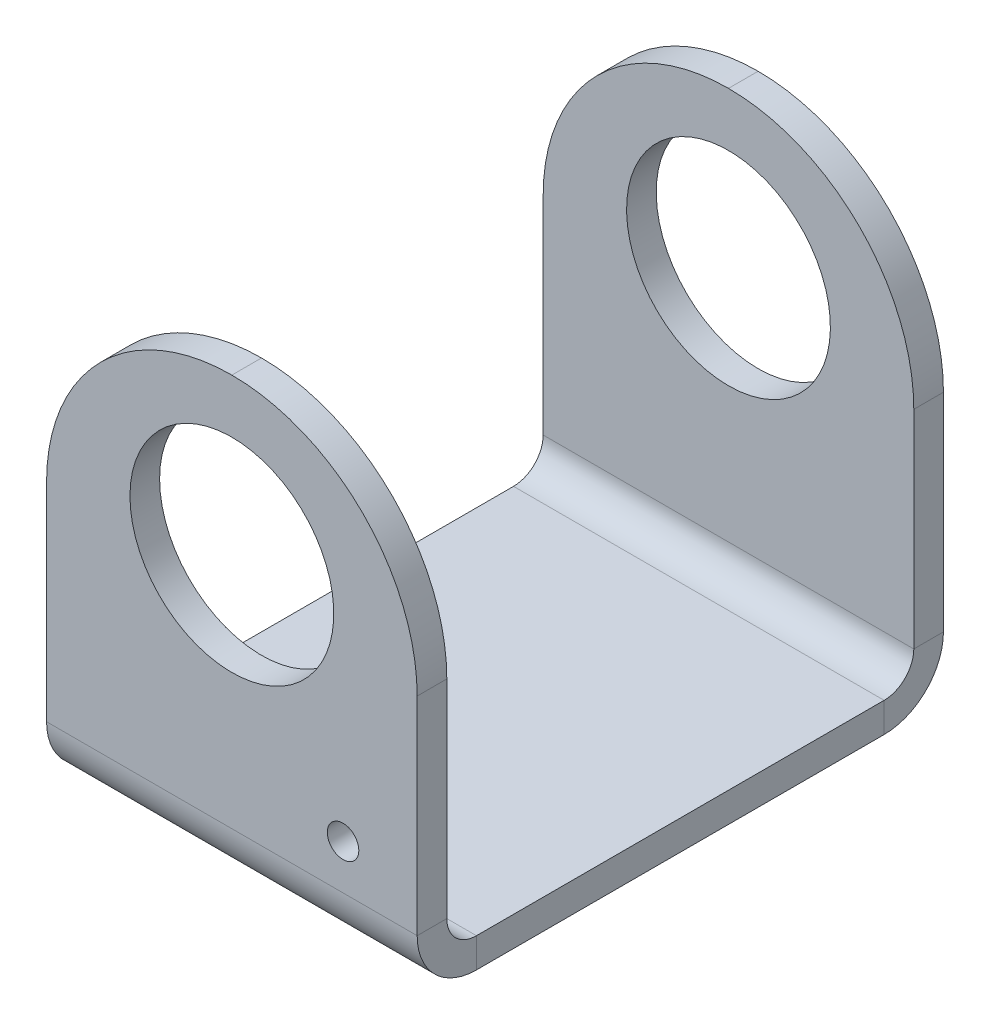
ISO-10303-21;
HEADER;
FILE_DESCRIPTION(('STEP AP214'),'2;1');
FILE_NAME('part.step','',(''),(''),'','','');
FILE_SCHEMA(('AUTOMOTIVE_DESIGN { 1 0 10303 214 1 1 1 1 }'));
ENDSEC;
DATA;
#1=APPLICATION_CONTEXT('core data for automotive mechanical design processes');
#2=APPLICATION_PROTOCOL_DEFINITION('international standard','automotive_design',2000,#1);
#3=PRODUCT_CONTEXT('',#1,'mechanical');
#4=PRODUCT('Part','Part','',(#3));
#5=PRODUCT_RELATED_PRODUCT_CATEGORY('part','',(#4));
#6=PRODUCT_DEFINITION_FORMATION('','',#4);
#7=PRODUCT_DEFINITION_CONTEXT('part definition',#1,'design');
#8=PRODUCT_DEFINITION('design','',#6,#7);
#9=PRODUCT_DEFINITION_SHAPE('','',#8);
#10=(LENGTH_UNIT() NAMED_UNIT(*) SI_UNIT(.MILLI.,.METRE.));
#11=(NAMED_UNIT(*) PLANE_ANGLE_UNIT() SI_UNIT($,.RADIAN.));
#12=(NAMED_UNIT(*) SI_UNIT($,.STERADIAN.) SOLID_ANGLE_UNIT());
#13=UNCERTAINTY_MEASURE_WITH_UNIT(LENGTH_MEASURE(1.E-05),#10,'distance_accuracy_value','');
#14=(GEOMETRIC_REPRESENTATION_CONTEXT(3) GLOBAL_UNCERTAINTY_ASSIGNED_CONTEXT((#13)) GLOBAL_UNIT_ASSIGNED_CONTEXT((#10,
#11,#12)) REPRESENTATION_CONTEXT('',''));
#15=CARTESIAN_POINT('',(0.,0.,0.));
#16=DIRECTION('',(0.,0.,1.));
#17=DIRECTION('',(1.,0.,0.));
#18=AXIS2_PLACEMENT_3D('',#15,#16,#17);
#19=CARTESIAN_POINT('',(-50.,-8.,-55.));
#20=DIRECTION('',(-1.,0.,0.));
#21=DIRECTION('',(0.,0.,1.));
#22=AXIS2_PLACEMENT_3D('',#19,#20,#21);
#23=PLANE('',#22);
#24=DIRECTION('',(0.,0.,1.));
#25=VECTOR('',#24,1.);
#26=CARTESIAN_POINT('',(-50.,0.,-55.));
#27=LINE('',#26,#25);
#28=CARTESIAN_POINT('',(-50.,0.,-55.));
#29=VERTEX_POINT('',#28);
#30=CARTESIAN_POINT('',(-50.,0.,55.));
#31=VERTEX_POINT('',#30);
#32=EDGE_CURVE('E269',#29,#31,#27,.T.);
#33=ORIENTED_EDGE('',*,*,#32,.F.);
#34=DIRECTION('',(0.,1.,0.));
#35=VECTOR('',#34,1.);
#36=CARTESIAN_POINT('',(-50.,-8.,-55.));
#37=LINE('',#36,#35);
#38=CARTESIAN_POINT('',(-50.,-8.0000000000001,-55.));
#39=VERTEX_POINT('',#38);
#40=EDGE_CURVE('E299',#39,#29,#37,.T.);
#41=ORIENTED_EDGE('',*,*,#40,.F.);
#42=DIRECTION('',(0.,0.,1.));
#43=VECTOR('',#42,1.);
#44=CARTESIAN_POINT('',(-50.,-8.,-55.));
#45=LINE('',#44,#43);
#46=CARTESIAN_POINT('',(-50.,-8.,55.));
#47=VERTEX_POINT('',#46);
#48=EDGE_CURVE('E278',#39,#47,#45,.T.);
#49=ORIENTED_EDGE('',*,*,#48,.T.);
#50=DIRECTION('',(0.,1.,0.));
#51=VECTOR('',#50,1.);
#52=CARTESIAN_POINT('',(-50.,-8.,55.));
#53=LINE('',#52,#51);
#54=EDGE_CURVE('E288',#47,#31,#53,.T.);
#55=ORIENTED_EDGE('',*,*,#54,.T.);
#56=EDGE_LOOP('',(#33,#41,#49,#55));
#57=FACE_BOUND('',#56,.T.);
#58=ADVANCED_FACE('F83',(#57),#23,.T.);
#59=CARTESIAN_POINT('',(50.,-8.,-55.));
#60=DIRECTION('',(1.,0.,0.));
#61=DIRECTION('',(0.,0.,-1.));
#62=AXIS2_PLACEMENT_3D('',#59,#60,#61);
#63=PLANE('',#62);
#64=DIRECTION('',(0.,0.,-1.));
#65=VECTOR('',#64,1.);
#66=CARTESIAN_POINT('',(50.,0.,-55.));
#67=LINE('',#66,#65);
#68=CARTESIAN_POINT('',(50.,0.,55.));
#69=VERTEX_POINT('',#68);
#70=CARTESIAN_POINT('',(50.,0.,-55.));
#71=VERTEX_POINT('',#70);
#72=EDGE_CURVE('E294',#69,#71,#67,.T.);
#73=ORIENTED_EDGE('',*,*,#72,.F.);
#74=DIRECTION('',(0.,1.,0.));
#75=VECTOR('',#74,1.);
#76=CARTESIAN_POINT('',(50.,-8.,55.));
#77=LINE('',#76,#75);
#78=CARTESIAN_POINT('',(50.,-7.99999999999999,55.));
#79=VERTEX_POINT('',#78);
#80=EDGE_CURVE('E304',#79,#69,#77,.T.);
#81=ORIENTED_EDGE('',*,*,#80,.F.);
#82=DIRECTION('',(0.,0.,-1.));
#83=VECTOR('',#82,1.);
#84=CARTESIAN_POINT('',(50.,-8.,-55.));
#85=LINE('',#84,#83);
#86=CARTESIAN_POINT('',(50.,-8.,-55.));
#87=VERTEX_POINT('',#86);
#88=EDGE_CURVE('E285',#79,#87,#85,.T.);
#89=ORIENTED_EDGE('',*,*,#88,.T.);
#90=DIRECTION('',(0.,1.,0.));
#91=VECTOR('',#90,1.);
#92=CARTESIAN_POINT('',(50.,-8.,-55.));
#93=LINE('',#92,#91);
#94=EDGE_CURVE('E302',#87,#71,#93,.T.);
#95=ORIENTED_EDGE('',*,*,#94,.T.);
#96=EDGE_LOOP('',(#73,#81,#89,#95));
#97=FACE_BOUND('',#96,.T.);
#98=ADVANCED_FACE('F385',(#97),#63,.T.);
#99=CARTESIAN_POINT('',(0.,-8.,0.));
#100=DIRECTION('',(0.,1.,0.));
#101=DIRECTION('',(0.,0.,1.));
#102=AXIS2_PLACEMENT_3D('',#99,#100,#101);
#103=PLANE('',#102);
#104=ORIENTED_EDGE('',*,*,#48,.F.);
#105=DIRECTION('',(-1.,0.,0.));
#106=VECTOR('',#105,1.);
#107=CARTESIAN_POINT('',(-50.,-8.,-55.));
#108=LINE('',#107,#106);
#109=EDGE_CURVE('E195',#87,#39,#108,.T.);
#110=ORIENTED_EDGE('',*,*,#109,.F.);
#111=ORIENTED_EDGE('',*,*,#88,.F.);
#112=DIRECTION('',(1.,0.,0.));
#113=VECTOR('',#112,1.);
#114=CARTESIAN_POINT('',(-50.,-8.,55.));
#115=LINE('',#114,#113);
#116=EDGE_CURVE('E281',#47,#79,#115,.T.);
#117=ORIENTED_EDGE('',*,*,#116,.F.);
#118=EDGE_LOOP('',(#104,#110,#111,#117));
#119=FACE_BOUND('',#118,.T.);
#120=ADVANCED_FACE('F391',(#119),#103,.F.);
#121=CARTESIAN_POINT('',(0.,0.,0.));
#122=DIRECTION('',(0.,1.,0.));
#123=DIRECTION('',(0.,0.,1.));
#124=AXIS2_PLACEMENT_3D('',#121,#122,#123);
#125=PLANE('',#124);
#126=ORIENTED_EDGE('',*,*,#32,.T.);
#127=DIRECTION('',(1.,0.,0.));
#128=VECTOR('',#127,1.);
#129=CARTESIAN_POINT('',(-50.,0.,55.));
#130=LINE('',#129,#128);
#131=EDGE_CURVE('E291',#31,#69,#130,.T.);
#132=ORIENTED_EDGE('',*,*,#131,.T.);
#133=ORIENTED_EDGE('',*,*,#72,.T.);
#134=DIRECTION('',(-1.,0.,0.));
#135=VECTOR('',#134,1.);
#136=CARTESIAN_POINT('',(-50.,0.,-55.));
#137=LINE('',#136,#135);
#138=EDGE_CURVE('E282',#71,#29,#137,.T.);
#139=ORIENTED_EDGE('',*,*,#138,.T.);
#140=EDGE_LOOP('',(#126,#132,#133,#139));
#141=FACE_BOUND('',#140,.T.);
#142=ADVANCED_FACE('F614',(#141),#125,.T.);
#143=CARTESIAN_POINT('',(-50.,7.99999999999997,55.));
#144=DIRECTION('',(-1.,0.,0.));
#145=DIRECTION('',(0.,0.,1.));
#146=AXIS2_PLACEMENT_3D('',#143,#144,#145);
#147=PLANE('',#146);
#148=DIRECTION('',(0.,0.,-1.));
#149=VECTOR('',#148,1.);
#150=CARTESIAN_POINT('',(-50.,7.99999999999997,71.));
#151=LINE('',#150,#149);
#152=CARTESIAN_POINT('',(-50.,7.99999999999997,63.));
#153=VERTEX_POINT('',#152);
#154=CARTESIAN_POINT('',(-50.,7.99999999999997,71.));
#155=VERTEX_POINT('',#154);
#156=EDGE_CURVE('E236',#153,#155,#151,.F.);
#157=ORIENTED_EDGE('',*,*,#156,.F.);
#158=CARTESIAN_POINT('',(-50.,7.99999999999997,55.));
#159=DIRECTION('',(1.,0.,0.));
#160=DIRECTION('',(0.,0.,-1.));
#161=AXIS2_PLACEMENT_3D('',#158,#159,#160);
#162=CIRCLE('',#161,7.99999999999997);
#163=EDGE_CURVE('E273',#31,#153,#162,.F.);
#164=ORIENTED_EDGE('',*,*,#163,.F.);
#165=ORIENTED_EDGE('',*,*,#54,.F.);
#166=CARTESIAN_POINT('',(-50.,7.99999999999997,55.));
#167=DIRECTION('',(1.,0.,0.));
#168=DIRECTION('',(0.,0.,-1.));
#169=AXIS2_PLACEMENT_3D('',#166,#167,#168);
#170=CIRCLE('',#169,16.);
#171=EDGE_CURVE('E266',#47,#155,#170,.F.);
#172=ORIENTED_EDGE('',*,*,#171,.T.);
#173=EDGE_LOOP('',(#157,#164,#165,#172));
#174=FACE_BOUND('',#173,.T.);
#175=ADVANCED_FACE('F365',(#174),#147,.T.);
#176=CARTESIAN_POINT('',(50.,7.99999999999997,55.));
#177=DIRECTION('',(-1.,0.,0.));
#178=DIRECTION('',(0.,0.,1.));
#179=AXIS2_PLACEMENT_3D('',#176,#177,#178);
#180=PLANE('',#179);
#181=CARTESIAN_POINT('',(50.,7.99999999999997,55.));
#182=DIRECTION('',(1.,0.,0.));
#183=DIRECTION('',(0.,0.,-1.));
#184=AXIS2_PLACEMENT_3D('',#181,#182,#183);
#185=CIRCLE('',#184,7.99999999999997);
#186=CARTESIAN_POINT('',(50.,7.99999999999997,63.));
#187=VERTEX_POINT('',#186);
#188=EDGE_CURVE('E243',#187,#69,#185,.T.);
#189=ORIENTED_EDGE('',*,*,#188,.F.);
#190=DIRECTION('',(0.,0.,-1.));
#191=VECTOR('',#190,1.);
#192=CARTESIAN_POINT('',(50.,7.99999999999997,63.));
#193=LINE('',#192,#191);
#194=CARTESIAN_POINT('',(50.,7.99999999999997,71.));
#195=VERTEX_POINT('',#194);
#196=EDGE_CURVE('E259',#187,#195,#193,.F.);
#197=ORIENTED_EDGE('',*,*,#196,.T.);
#198=CARTESIAN_POINT('',(50.,7.99999999999997,55.));
#199=DIRECTION('',(1.,0.,0.));
#200=DIRECTION('',(0.,0.,-1.));
#201=AXIS2_PLACEMENT_3D('',#198,#199,#200);
#202=CIRCLE('',#201,16.);
#203=EDGE_CURVE('E270',#195,#79,#202,.T.);
#204=ORIENTED_EDGE('',*,*,#203,.T.);
#205=ORIENTED_EDGE('',*,*,#80,.T.);
#206=EDGE_LOOP('',(#189,#197,#204,#205));
#207=FACE_BOUND('',#206,.T.);
#208=ADVANCED_FACE('F354',(#207),#180,.F.);
#209=CARTESIAN_POINT('',(50.,7.99999999999997,55.));
#210=DIRECTION('',(1.,0.,0.));
#211=DIRECTION('',(0.,0.,1.));
#212=AXIS2_PLACEMENT_3D('',#209,#210,#211);
#213=CYLINDRICAL_SURFACE('',#212,16.);
#214=ORIENTED_EDGE('',*,*,#116,.T.);
#215=ORIENTED_EDGE('',*,*,#203,.F.);
#216=DIRECTION('',(1.,0.,0.));
#217=VECTOR('',#216,1.);
#218=CARTESIAN_POINT('',(-50.,7.99999999999997,71.));
#219=LINE('',#218,#217);
#220=EDGE_CURVE('E256',#195,#155,#219,.F.);
#221=ORIENTED_EDGE('',*,*,#220,.T.);
#222=ORIENTED_EDGE('',*,*,#171,.F.);
#223=EDGE_LOOP('',(#214,#215,#221,#222));
#224=FACE_BOUND('',#223,.T.);
#225=ADVANCED_FACE('F369',(#224),#213,.T.);
#226=CARTESIAN_POINT('',(50.,7.99999999999997,55.));
#227=DIRECTION('',(1.,0.,0.));
#228=DIRECTION('',(0.,0.,1.));
#229=AXIS2_PLACEMENT_3D('',#226,#227,#228);
#230=CYLINDRICAL_SURFACE('',#229,7.99999999999997);
#231=ORIENTED_EDGE('',*,*,#131,.F.);
#232=ORIENTED_EDGE('',*,*,#163,.T.);
#233=DIRECTION('',(1.,0.,0.));
#234=VECTOR('',#233,1.);
#235=CARTESIAN_POINT('',(-50.,7.99999999999997,63.));
#236=LINE('',#235,#234);
#237=EDGE_CURVE('E262',#153,#187,#236,.T.);
#238=ORIENTED_EDGE('',*,*,#237,.T.);
#239=ORIENTED_EDGE('',*,*,#188,.T.);
#240=EDGE_LOOP('',(#231,#232,#238,#239));
#241=FACE_BOUND('',#240,.T.);
#242=ADVANCED_FACE('F358',(#241),#230,.F.);
#243=CARTESIAN_POINT('',(0.,0.,71.));
#244=DIRECTION('',(0.,0.,-1.));
#245=DIRECTION('',(-1.,0.,0.));
#246=AXIS2_PLACEMENT_3D('',#243,#244,#245);
#247=PLANE('',#246);
#248=CARTESIAN_POINT('',(30.0000000000001,20.0384757729337,71.));
#249=DIRECTION('',(0.,0.,1.));
#250=DIRECTION('',(1.,0.,0.));
#251=AXIS2_PLACEMENT_3D('',#248,#249,#250);
#252=CIRCLE('',#251,4.24999999999999);
#253=CARTESIAN_POINT('',(34.2500000000001,20.0384757729337,71.));
#254=VERTEX_POINT('',#253);
#255=EDGE_CURVE('E310',#254,#254,#252,.T.);
#256=ORIENTED_EDGE('',*,*,#255,.F.);
#257=EDGE_LOOP('',(#256));
#258=FACE_BOUND('',#257,.T.);
#259=CARTESIAN_POINT('',(0.,72.,71.));
#260=DIRECTION('',(0.,0.,-1.));
#261=DIRECTION('',(-1.,0.,0.));
#262=AXIS2_PLACEMENT_3D('',#259,#260,#261);
#263=CIRCLE('',#262,27.5);
#264=CARTESIAN_POINT('',(-27.5,72.,71.));
#265=VERTEX_POINT('',#264);
#266=EDGE_CURVE('E250',#265,#265,#263,.F.);
#267=ORIENTED_EDGE('',*,*,#266,.F.);
#268=EDGE_LOOP('',(#267));
#269=FACE_BOUND('',#268,.T.);
#270=CARTESIAN_POINT('',(0.,64.,71.));
#271=DIRECTION('',(0.,0.,-1.));
#272=DIRECTION('',(-1.,0.,0.));
#273=AXIS2_PLACEMENT_3D('',#270,#271,#272);
#274=CIRCLE('',#273,50.);
#275=CARTESIAN_POINT('',(50.,64.,71.));
#276=VERTEX_POINT('',#275);
#277=CARTESIAN_POINT('',(0.,114.,71.));
#278=VERTEX_POINT('',#277);
#279=EDGE_CURVE('E100',#276,#278,#274,.F.);
#280=ORIENTED_EDGE('',*,*,#279,.T.);
#281=CARTESIAN_POINT('',(0.,64.,71.));
#282=DIRECTION('',(0.,0.,-1.));
#283=DIRECTION('',(-1.,0.,0.));
#284=AXIS2_PLACEMENT_3D('',#281,#282,#283);
#285=CIRCLE('',#284,50.);
#286=CARTESIAN_POINT('',(-50.,64.,71.));
#287=VERTEX_POINT('',#286);
#288=EDGE_CURVE('E92',#278,#287,#285,.F.);
#289=ORIENTED_EDGE('',*,*,#288,.T.);
#290=DIRECTION('',(0.,-1.,0.));
#291=VECTOR('',#290,1.);
#292=CARTESIAN_POINT('',(-50.,0.,71.));
#293=LINE('',#292,#291);
#294=EDGE_CURVE('E244',#287,#155,#293,.T.);
#295=ORIENTED_EDGE('',*,*,#294,.T.);
#296=ORIENTED_EDGE('',*,*,#220,.F.);
#297=DIRECTION('',(0.,1.,0.));
#298=VECTOR('',#297,1.);
#299=CARTESIAN_POINT('',(50.,0.,71.));
#300=LINE('',#299,#298);
#301=EDGE_CURVE('E241',#195,#276,#300,.T.);
#302=ORIENTED_EDGE('',*,*,#301,.T.);
#303=EDGE_LOOP('',(#280,#289,#295,#296,#302));
#304=FACE_BOUND('',#303,.T.);
#305=ADVANCED_FACE('F370',(#258,#269,#304),#247,.F.);
#306=CARTESIAN_POINT('',(0.,0.,63.));
#307=DIRECTION('',(0.,0.,-1.));
#308=DIRECTION('',(-1.,0.,0.));
#309=AXIS2_PLACEMENT_3D('',#306,#307,#308);
#310=PLANE('',#309);
#311=CARTESIAN_POINT('',(30.0000000000001,20.0384757729337,63.));
#312=DIRECTION('',(0.,0.,-1.));
#313=DIRECTION('',(-1.,0.,0.));
#314=AXIS2_PLACEMENT_3D('',#311,#312,#313);
#315=CIRCLE('',#314,4.24999999999999);
#316=CARTESIAN_POINT('',(25.7500000000001,20.0384757729337,63.));
#317=VERTEX_POINT('',#316);
#318=EDGE_CURVE('E235',#317,#317,#315,.T.);
#319=ORIENTED_EDGE('',*,*,#318,.F.);
#320=EDGE_LOOP('',(#319));
#321=FACE_BOUND('',#320,.T.);
#322=CARTESIAN_POINT('',(0.,72.,63.));
#323=DIRECTION('',(0.,0.,-1.));
#324=DIRECTION('',(-1.,0.,0.));
#325=AXIS2_PLACEMENT_3D('',#322,#323,#324);
#326=CIRCLE('',#325,27.5);
#327=CARTESIAN_POINT('',(-27.5,72.,63.));
#328=VERTEX_POINT('',#327);
#329=EDGE_CURVE('E253',#328,#328,#326,.F.);
#330=ORIENTED_EDGE('',*,*,#329,.T.);
#331=EDGE_LOOP('',(#330));
#332=FACE_BOUND('',#331,.T.);
#333=DIRECTION('',(0.,1.,0.));
#334=VECTOR('',#333,1.);
#335=CARTESIAN_POINT('',(-50.,0.,63.));
#336=LINE('',#335,#334);
#337=CARTESIAN_POINT('',(-50.,64.,63.));
#338=VERTEX_POINT('',#337);
#339=EDGE_CURVE('E248',#338,#153,#336,.F.);
#340=ORIENTED_EDGE('',*,*,#339,.F.);
#341=CARTESIAN_POINT('',(0.,64.,63.));
#342=DIRECTION('',(0.,0.,-1.));
#343=DIRECTION('',(-1.,0.,0.));
#344=AXIS2_PLACEMENT_3D('',#341,#342,#343);
#345=CIRCLE('',#344,50.);
#346=CARTESIAN_POINT('',(0.,114.,63.));
#347=VERTEX_POINT('',#346);
#348=EDGE_CURVE('E327',#338,#347,#345,.T.);
#349=ORIENTED_EDGE('',*,*,#348,.T.);
#350=CARTESIAN_POINT('',(0.,64.,63.));
#351=DIRECTION('',(0.,0.,-1.));
#352=DIRECTION('',(-1.,0.,0.));
#353=AXIS2_PLACEMENT_3D('',#350,#351,#352);
#354=CIRCLE('',#353,50.);
#355=CARTESIAN_POINT('',(50.,64.,63.));
#356=VERTEX_POINT('',#355);
#357=EDGE_CURVE('E325',#347,#356,#354,.T.);
#358=ORIENTED_EDGE('',*,*,#357,.T.);
#359=DIRECTION('',(0.,-1.,0.));
#360=VECTOR('',#359,1.);
#361=CARTESIAN_POINT('',(50.,114.,63.));
#362=LINE('',#361,#360);
#363=EDGE_CURVE('E246',#187,#356,#362,.F.);
#364=ORIENTED_EDGE('',*,*,#363,.F.);
#365=ORIENTED_EDGE('',*,*,#237,.F.);
#366=EDGE_LOOP('',(#340,#349,#358,#364,#365));
#367=FACE_BOUND('',#366,.T.);
#368=ADVANCED_FACE('F347',(#321,#332,#367),#310,.T.);
#369=CARTESIAN_POINT('',(-50.,0.,71.));
#370=DIRECTION('',(1.,0.,0.));
#371=DIRECTION('',(0.,1.,0.));
#372=AXIS2_PLACEMENT_3D('',#369,#370,#371);
#373=PLANE('',#372);
#374=ORIENTED_EDGE('',*,*,#294,.F.);
#375=DIRECTION('',(0.,0.,-1.));
#376=VECTOR('',#375,1.);
#377=CARTESIAN_POINT('',(-50.,64.,71.));
#378=LINE('',#377,#376);
#379=EDGE_CURVE('E322',#287,#338,#378,.T.);
#380=ORIENTED_EDGE('',*,*,#379,.T.);
#381=ORIENTED_EDGE('',*,*,#339,.T.);
#382=ORIENTED_EDGE('',*,*,#156,.T.);
#383=EDGE_LOOP('',(#374,#380,#381,#382));
#384=FACE_BOUND('',#383,.T.);
#385=ADVANCED_FACE('F363',(#384),#373,.F.);
#386=CARTESIAN_POINT('',(50.,114.,71.));
#387=DIRECTION('',(-1.,0.,0.));
#388=DIRECTION('',(0.,-1.,0.));
#389=AXIS2_PLACEMENT_3D('',#386,#387,#388);
#390=PLANE('',#389);
#391=ORIENTED_EDGE('',*,*,#363,.T.);
#392=DIRECTION('',(0.,0.,-1.));
#393=VECTOR('',#392,1.);
#394=CARTESIAN_POINT('',(50.,64.,71.));
#395=LINE('',#394,#393);
#396=EDGE_CURVE('E13',#356,#276,#395,.F.);
#397=ORIENTED_EDGE('',*,*,#396,.T.);
#398=ORIENTED_EDGE('',*,*,#301,.F.);
#399=ORIENTED_EDGE('',*,*,#196,.F.);
#400=EDGE_LOOP('',(#391,#397,#398,#399));
#401=FACE_BOUND('',#400,.T.);
#402=ADVANCED_FACE('F350',(#401),#390,.F.);
#403=CARTESIAN_POINT('',(0.,72.,71.));
#404=DIRECTION('',(0.,0.,-1.));
#405=DIRECTION('',(-1.,0.,0.));
#406=AXIS2_PLACEMENT_3D('',#403,#404,#405);
#407=CYLINDRICAL_SURFACE('',#406,27.5);
#408=ORIENTED_EDGE('',*,*,#266,.T.);
#409=EDGE_LOOP('',(#408));
#410=FACE_BOUND('',#409,.T.);
#411=ORIENTED_EDGE('',*,*,#329,.F.);
#412=EDGE_LOOP('',(#411));
#413=FACE_BOUND('',#412,.T.);
#414=ADVANCED_FACE('F490',(#410,#413),#407,.F.);
#415=CARTESIAN_POINT('',(50.,7.99999999999992,-55.));
#416=DIRECTION('',(1.,0.,0.));
#417=DIRECTION('',(0.,1.,0.));
#418=AXIS2_PLACEMENT_3D('',#415,#416,#417);
#419=PLANE('',#418);
#420=DIRECTION('',(0.,0.,1.));
#421=VECTOR('',#420,1.);
#422=CARTESIAN_POINT('',(50.,8.00000000000003,-70.9999999999999));
#423=LINE('',#422,#421);
#424=CARTESIAN_POINT('',(50.,7.99999999999989,-63.));
#425=VERTEX_POINT('',#424);
#426=CARTESIAN_POINT('',(50.,7.99999999999986,-71.));
#427=VERTEX_POINT('',#426);
#428=EDGE_CURVE('E232',#425,#427,#423,.F.);
#429=ORIENTED_EDGE('',*,*,#428,.F.);
#430=CARTESIAN_POINT('',(50.,7.99999999999992,-55.));
#431=DIRECTION('',(-1.,0.,0.));
#432=DIRECTION('',(0.,-1.,0.));
#433=AXIS2_PLACEMENT_3D('',#430,#431,#432);
#434=CIRCLE('',#433,8.00000000000001);
#435=EDGE_CURVE('E199',#71,#425,#434,.F.);
#436=ORIENTED_EDGE('',*,*,#435,.F.);
#437=ORIENTED_EDGE('',*,*,#94,.F.);
#438=CARTESIAN_POINT('',(50.,7.99999999999992,-55.));
#439=DIRECTION('',(-1.,0.,0.));
#440=DIRECTION('',(0.,-1.,0.));
#441=AXIS2_PLACEMENT_3D('',#438,#439,#440);
#442=CIRCLE('',#441,16.);
#443=EDGE_CURVE('E198',#87,#427,#442,.F.);
#444=ORIENTED_EDGE('',*,*,#443,.T.);
#445=EDGE_LOOP('',(#429,#436,#437,#444));
#446=FACE_BOUND('',#445,.T.);
#447=ADVANCED_FACE('F483',(#446),#419,.T.);
#448=CARTESIAN_POINT('',(-50.,7.99999999999991,-55.));
#449=DIRECTION('',(1.,0.,0.));
#450=DIRECTION('',(0.,1.,0.));
#451=AXIS2_PLACEMENT_3D('',#448,#449,#450);
#452=PLANE('',#451);
#453=CARTESIAN_POINT('',(-50.,7.99999999999991,-55.));
#454=DIRECTION('',(-1.,0.,0.));
#455=DIRECTION('',(0.,-1.,0.));
#456=AXIS2_PLACEMENT_3D('',#453,#454,#455);
#457=CIRCLE('',#456,8.00000000000001);
#458=CARTESIAN_POINT('',(-50.,7.99999999999988,-63.));
#459=VERTEX_POINT('',#458);
#460=EDGE_CURVE('E207',#459,#29,#457,.T.);
#461=ORIENTED_EDGE('',*,*,#460,.F.);
#462=DIRECTION('',(0.,0.,1.));
#463=VECTOR('',#462,1.);
#464=CARTESIAN_POINT('',(-50.,7.99999999999997,-63.));
#465=LINE('',#464,#463);
#466=CARTESIAN_POINT('',(-50.,8.00000000000002,-71.));
#467=VERTEX_POINT('',#466);
#468=EDGE_CURVE('E203',#459,#467,#465,.F.);
#469=ORIENTED_EDGE('',*,*,#468,.T.);
#470=CARTESIAN_POINT('',(-50.,7.99999999999991,-55.));
#471=DIRECTION('',(-1.,0.,0.));
#472=DIRECTION('',(0.,-1.,0.));
#473=AXIS2_PLACEMENT_3D('',#470,#471,#472);
#474=CIRCLE('',#473,16.);
#475=EDGE_CURVE('E187',#467,#39,#474,.T.);
#476=ORIENTED_EDGE('',*,*,#475,.T.);
#477=ORIENTED_EDGE('',*,*,#40,.T.);
#478=EDGE_LOOP('',(#461,#469,#476,#477));
#479=FACE_BOUND('',#478,.T.);
#480=ADVANCED_FACE('F205',(#479),#452,.F.);
#481=CARTESIAN_POINT('',(-50.,7.99999999999991,-55.));
#482=DIRECTION('',(-1.,0.,0.));
#483=DIRECTION('',(0.,0.,-1.));
#484=AXIS2_PLACEMENT_3D('',#481,#482,#483);
#485=CYLINDRICAL_SURFACE('',#484,16.);
#486=ORIENTED_EDGE('',*,*,#109,.T.);
#487=ORIENTED_EDGE('',*,*,#475,.F.);
#488=DIRECTION('',(-1.,0.,0.));
#489=VECTOR('',#488,1.);
#490=CARTESIAN_POINT('',(50.,8.00000000000003,-71.));
#491=LINE('',#490,#489);
#492=EDGE_CURVE('E192',#467,#427,#491,.F.);
#493=ORIENTED_EDGE('',*,*,#492,.T.);
#494=ORIENTED_EDGE('',*,*,#443,.F.);
#495=EDGE_LOOP('',(#486,#487,#493,#494));
#496=FACE_BOUND('',#495,.T.);
#497=ADVANCED_FACE('F189',(#496),#485,.T.);
#498=CARTESIAN_POINT('',(-50.,7.99999999999991,-55.));
#499=DIRECTION('',(-1.,0.,0.));
#500=DIRECTION('',(0.,0.,-1.));
#501=AXIS2_PLACEMENT_3D('',#498,#499,#500);
#502=CYLINDRICAL_SURFACE('',#501,8.00000000000001);
#503=ORIENTED_EDGE('',*,*,#138,.F.);
#504=ORIENTED_EDGE('',*,*,#435,.T.);
#505=DIRECTION('',(-1.,0.,0.));
#506=VECTOR('',#505,1.);
#507=CARTESIAN_POINT('',(50.,7.99999999999997,-63.));
#508=LINE('',#507,#506);
#509=EDGE_CURVE('E211',#425,#459,#508,.T.);
#510=ORIENTED_EDGE('',*,*,#509,.T.);
#511=ORIENTED_EDGE('',*,*,#460,.T.);
#512=EDGE_LOOP('',(#503,#504,#510,#511));
#513=FACE_BOUND('',#512,.T.);
#514=ADVANCED_FACE('F462',(#513),#502,.F.);
#515=CARTESIAN_POINT('',(0.,-2.18751433068194E-13,-71.));
#516=DIRECTION('',(0.,0.,1.));
#517=DIRECTION('',(0.,-1.,0.));
#518=AXIS2_PLACEMENT_3D('',#515,#516,#517);
#519=PLANE('',#518);
#520=CARTESIAN_POINT('',(0.,72.,-71.0000000000002));
#521=DIRECTION('',(0.,0.,1.));
#522=DIRECTION('',(0.,-1.,0.));
#523=AXIS2_PLACEMENT_3D('',#520,#521,#522);
#524=CIRCLE('',#523,27.5);
#525=CARTESIAN_POINT('',(0.,44.5,-71.0000000000001));
#526=VERTEX_POINT('',#525);
#527=EDGE_CURVE('E227',#526,#526,#524,.F.);
#528=ORIENTED_EDGE('',*,*,#527,.F.);
#529=EDGE_LOOP('',(#528));
#530=FACE_BOUND('',#529,.T.);
#531=CARTESIAN_POINT('',(0.,64.,-71.0000000000002));
#532=DIRECTION('',(0.,0.,1.));
#533=DIRECTION('',(0.,-1.,0.));
#534=AXIS2_PLACEMENT_3D('',#531,#532,#533);
#535=CIRCLE('',#534,50.);
#536=CARTESIAN_POINT('',(-50.,64.,-71.0000000000002));
#537=VERTEX_POINT('',#536);
#538=CARTESIAN_POINT('',(0.,114.,-71.0000000000004));
#539=VERTEX_POINT('',#538);
#540=EDGE_CURVE('E317',#537,#539,#535,.F.);
#541=ORIENTED_EDGE('',*,*,#540,.T.);
#542=CARTESIAN_POINT('',(0.,64.,-71.0000000000002));
#543=DIRECTION('',(0.,0.,1.));
#544=DIRECTION('',(0.,-1.,0.));
#545=AXIS2_PLACEMENT_3D('',#542,#543,#544);
#546=CIRCLE('',#545,50.);
#547=CARTESIAN_POINT('',(50.,64.,-71.0000000000002));
#548=VERTEX_POINT('',#547);
#549=EDGE_CURVE('E319',#539,#548,#546,.F.);
#550=ORIENTED_EDGE('',*,*,#549,.T.);
#551=DIRECTION('',(0.,-1.,0.));
#552=VECTOR('',#551,1.);
#553=CARTESIAN_POINT('',(50.,-2.15708058548936E-13,-71.));
#554=LINE('',#553,#552);
#555=EDGE_CURVE('E220',#548,#427,#554,.T.);
#556=ORIENTED_EDGE('',*,*,#555,.T.);
#557=ORIENTED_EDGE('',*,*,#492,.F.);
#558=DIRECTION('',(0.,1.,0.));
#559=VECTOR('',#558,1.);
#560=CARTESIAN_POINT('',(-50.,-2.12664684029679E-13,-71.));
#561=LINE('',#560,#559);
#562=EDGE_CURVE('E214',#467,#537,#561,.T.);
#563=ORIENTED_EDGE('',*,*,#562,.T.);
#564=EDGE_LOOP('',(#541,#550,#556,#557,#563));
#565=FACE_BOUND('',#564,.T.);
#566=ADVANCED_FACE('F222',(#530,#565),#519,.F.);
#567=CARTESIAN_POINT('',(0.,-1.90819582357449E-13,-63.));
#568=DIRECTION('',(0.,0.,1.));
#569=DIRECTION('',(0.,-1.,0.));
#570=AXIS2_PLACEMENT_3D('',#567,#568,#569);
#571=PLANE('',#570);
#572=CARTESIAN_POINT('',(0.,72.,-63.0000000000002));
#573=DIRECTION('',(0.,0.,1.));
#574=DIRECTION('',(0.,-1.,0.));
#575=AXIS2_PLACEMENT_3D('',#572,#573,#574);
#576=CIRCLE('',#575,27.5);
#577=CARTESIAN_POINT('',(0.,44.5,-63.0000000000001));
#578=VERTEX_POINT('',#577);
#579=EDGE_CURVE('E224',#578,#578,#576,.F.);
#580=ORIENTED_EDGE('',*,*,#579,.T.);
#581=EDGE_LOOP('',(#580));
#582=FACE_BOUND('',#581,.T.);
#583=DIRECTION('',(0.,1.,0.));
#584=VECTOR('',#583,1.);
#585=CARTESIAN_POINT('',(50.,0.,-63.));
#586=LINE('',#585,#584);
#587=CARTESIAN_POINT('',(50.,64.,-63.0000000000002));
#588=VERTEX_POINT('',#587);
#589=EDGE_CURVE('E668',#588,#425,#586,.F.);
#590=ORIENTED_EDGE('',*,*,#589,.F.);
#591=CARTESIAN_POINT('',(0.,64.,-63.0000000000002));
#592=DIRECTION('',(0.,0.,1.));
#593=DIRECTION('',(0.,-1.,0.));
#594=AXIS2_PLACEMENT_3D('',#591,#592,#593);
#595=CIRCLE('',#594,50.);
#596=CARTESIAN_POINT('',(0.,114.,-63.0000000000004));
#597=VERTEX_POINT('',#596);
#598=EDGE_CURVE('E315',#588,#597,#595,.T.);
#599=ORIENTED_EDGE('',*,*,#598,.T.);
#600=CARTESIAN_POINT('',(0.,64.,-63.0000000000002));
#601=DIRECTION('',(0.,0.,1.));
#602=DIRECTION('',(0.,-1.,0.));
#603=AXIS2_PLACEMENT_3D('',#600,#601,#602);
#604=CIRCLE('',#603,50.);
#605=CARTESIAN_POINT('',(-50.,64.,-63.0000000000002));
#606=VERTEX_POINT('',#605);
#607=EDGE_CURVE('E313',#597,#606,#604,.T.);
#608=ORIENTED_EDGE('',*,*,#607,.T.);
#609=DIRECTION('',(0.,-1.,0.));
#610=VECTOR('',#609,1.);
#611=CARTESIAN_POINT('',(-50.,114.,-63.0000000000004));
#612=LINE('',#611,#610);
#613=EDGE_CURVE('E669',#459,#606,#612,.F.);
#614=ORIENTED_EDGE('',*,*,#613,.F.);
#615=ORIENTED_EDGE('',*,*,#509,.F.);
#616=EDGE_LOOP('',(#590,#599,#608,#614,#615));
#617=FACE_BOUND('',#616,.T.);
#618=ADVANCED_FACE('F447',(#582,#617),#571,.T.);
#619=CARTESIAN_POINT('',(50.,0.,-71.));
#620=DIRECTION('',(-1.,0.,0.));
#621=DIRECTION('',(0.,-1.,0.));
#622=AXIS2_PLACEMENT_3D('',#619,#620,#621);
#623=PLANE('',#622);
#624=ORIENTED_EDGE('',*,*,#555,.F.);
#625=DIRECTION('',(0.,0.,1.));
#626=VECTOR('',#625,1.);
#627=CARTESIAN_POINT('',(50.,64.,-71.0000000000002));
#628=LINE('',#627,#626);
#629=EDGE_CURVE('E301',#548,#588,#628,.T.);
#630=ORIENTED_EDGE('',*,*,#629,.T.);
#631=ORIENTED_EDGE('',*,*,#589,.T.);
#632=ORIENTED_EDGE('',*,*,#428,.T.);
#633=EDGE_LOOP('',(#624,#630,#631,#632));
#634=FACE_BOUND('',#633,.T.);
#635=ADVANCED_FACE('F440',(#634),#623,.F.);
#636=CARTESIAN_POINT('',(-50.,114.,-71.0000000000004));
#637=DIRECTION('',(1.,0.,0.));
#638=DIRECTION('',(0.,1.,0.));
#639=AXIS2_PLACEMENT_3D('',#636,#637,#638);
#640=PLANE('',#639);
#641=ORIENTED_EDGE('',*,*,#613,.T.);
#642=DIRECTION('',(0.,0.,1.));
#643=VECTOR('',#642,1.);
#644=CARTESIAN_POINT('',(-50.,64.,-71.0000000000002));
#645=LINE('',#644,#643);
#646=EDGE_CURVE('E217',#606,#537,#645,.F.);
#647=ORIENTED_EDGE('',*,*,#646,.T.);
#648=ORIENTED_EDGE('',*,*,#562,.F.);
#649=ORIENTED_EDGE('',*,*,#468,.F.);
#650=EDGE_LOOP('',(#641,#647,#648,#649));
#651=FACE_BOUND('',#650,.T.);
#652=ADVANCED_FACE('F215',(#651),#640,.F.);
#653=CARTESIAN_POINT('',(0.,72.,-71.0000000000002));
#654=DIRECTION('',(0.,0.,1.));
#655=DIRECTION('',(0.,-1.,0.));
#656=AXIS2_PLACEMENT_3D('',#653,#654,#655);
#657=CYLINDRICAL_SURFACE('',#656,27.5);
#658=ORIENTED_EDGE('',*,*,#527,.T.);
#659=EDGE_LOOP('',(#658));
#660=FACE_BOUND('',#659,.T.);
#661=ORIENTED_EDGE('',*,*,#579,.F.);
#662=EDGE_LOOP('',(#661));
#663=FACE_BOUND('',#662,.T.);
#664=ADVANCED_FACE('F424',(#660,#663),#657,.F.);
#665=CARTESIAN_POINT('',(30.0000000000001,20.0384757729337,71.));
#666=DIRECTION('',(0.,0.,1.));
#667=DIRECTION('',(1.,0.,0.));
#668=AXIS2_PLACEMENT_3D('',#665,#666,#667);
#669=CYLINDRICAL_SURFACE('',#668,4.24999999999999);
#670=ORIENTED_EDGE('',*,*,#318,.T.);
#671=EDGE_LOOP('',(#670));
#672=FACE_BOUND('',#671,.T.);
#673=ORIENTED_EDGE('',*,*,#255,.T.);
#674=EDGE_LOOP('',(#673));
#675=FACE_BOUND('',#674,.T.);
#676=ADVANCED_FACE('F401',(#672,#675),#669,.F.);
#677=CARTESIAN_POINT('',(0.,64.,-71.0000000000002));
#678=DIRECTION('',(0.,0.,1.));
#679=DIRECTION('',(0.,-1.,0.));
#680=AXIS2_PLACEMENT_3D('',#677,#678,#679);
#681=CYLINDRICAL_SURFACE('',#680,50.);
#682=DIRECTION('',(0.,0.,1.));
#683=VECTOR('',#682,1.);
#684=CARTESIAN_POINT('',(0.,114.,-71.0000000000004));
#685=LINE('',#684,#683);
#686=EDGE_CURVE('E330',#539,#597,#685,.T.);
#687=ORIENTED_EDGE('',*,*,#686,.F.);
#688=ORIENTED_EDGE('',*,*,#540,.F.);
#689=ORIENTED_EDGE('',*,*,#646,.F.);
#690=ORIENTED_EDGE('',*,*,#607,.F.);
#691=EDGE_LOOP('',(#687,#688,#689,#690));
#692=FACE_BOUND('',#691,.T.);
#693=ADVANCED_FACE('F399',(#692),#681,.T.);
#694=CARTESIAN_POINT('',(0.,64.,-71.0000000000002));
#695=DIRECTION('',(0.,0.,1.));
#696=DIRECTION('',(0.,-1.,0.));
#697=AXIS2_PLACEMENT_3D('',#694,#695,#696);
#698=CYLINDRICAL_SURFACE('',#697,50.);
#699=ORIENTED_EDGE('',*,*,#549,.F.);
#700=ORIENTED_EDGE('',*,*,#686,.T.);
#701=ORIENTED_EDGE('',*,*,#598,.F.);
#702=ORIENTED_EDGE('',*,*,#629,.F.);
#703=EDGE_LOOP('',(#699,#700,#701,#702));
#704=FACE_BOUND('',#703,.T.);
#705=ADVANCED_FACE('F396',(#704),#698,.T.);
#706=CARTESIAN_POINT('',(0.,64.,71.));
#707=DIRECTION('',(0.,0.,-1.));
#708=DIRECTION('',(-1.,0.,0.));
#709=AXIS2_PLACEMENT_3D('',#706,#707,#708);
#710=CYLINDRICAL_SURFACE('',#709,50.);
#711=DIRECTION('',(0.,0.,-1.));
#712=VECTOR('',#711,1.);
#713=CARTESIAN_POINT('',(0.,114.,71.));
#714=LINE('',#713,#712);
#715=EDGE_CURVE('E87',#278,#347,#714,.T.);
#716=ORIENTED_EDGE('',*,*,#715,.F.);
#717=ORIENTED_EDGE('',*,*,#279,.F.);
#718=ORIENTED_EDGE('',*,*,#396,.F.);
#719=ORIENTED_EDGE('',*,*,#357,.F.);
#720=EDGE_LOOP('',(#716,#717,#718,#719));
#721=FACE_BOUND('',#720,.T.);
#722=ADVANCED_FACE('F85',(#721),#710,.T.);
#723=CARTESIAN_POINT('',(0.,64.,71.));
#724=DIRECTION('',(0.,0.,-1.));
#725=DIRECTION('',(-1.,0.,0.));
#726=AXIS2_PLACEMENT_3D('',#723,#724,#725);
#727=CYLINDRICAL_SURFACE('',#726,50.);
#728=ORIENTED_EDGE('',*,*,#288,.F.);
#729=ORIENTED_EDGE('',*,*,#715,.T.);
#730=ORIENTED_EDGE('',*,*,#348,.F.);
#731=ORIENTED_EDGE('',*,*,#379,.F.);
#732=EDGE_LOOP('',(#728,#729,#730,#731));
#733=FACE_BOUND('',#732,.T.);
#734=ADVANCED_FACE('F340',(#733),#727,.T.);
#735=CLOSED_SHELL('',(#58,#98,#120,#142,#175,#208,#225,#242,#305,#368,#385,#402,#414,#447,#480,
#497,#514,#566,#618,#635,#652,#664,#676,#693,#705,#722,#734));
#736=MANIFOLD_SOLID_BREP('B2',#735);
#737=ADVANCED_BREP_SHAPE_REPRESENTATION('',(#18,#736),#14);
#738=SHAPE_DEFINITION_REPRESENTATION(#9,#737);
ENDSEC;
END-ISO-10303-21;
